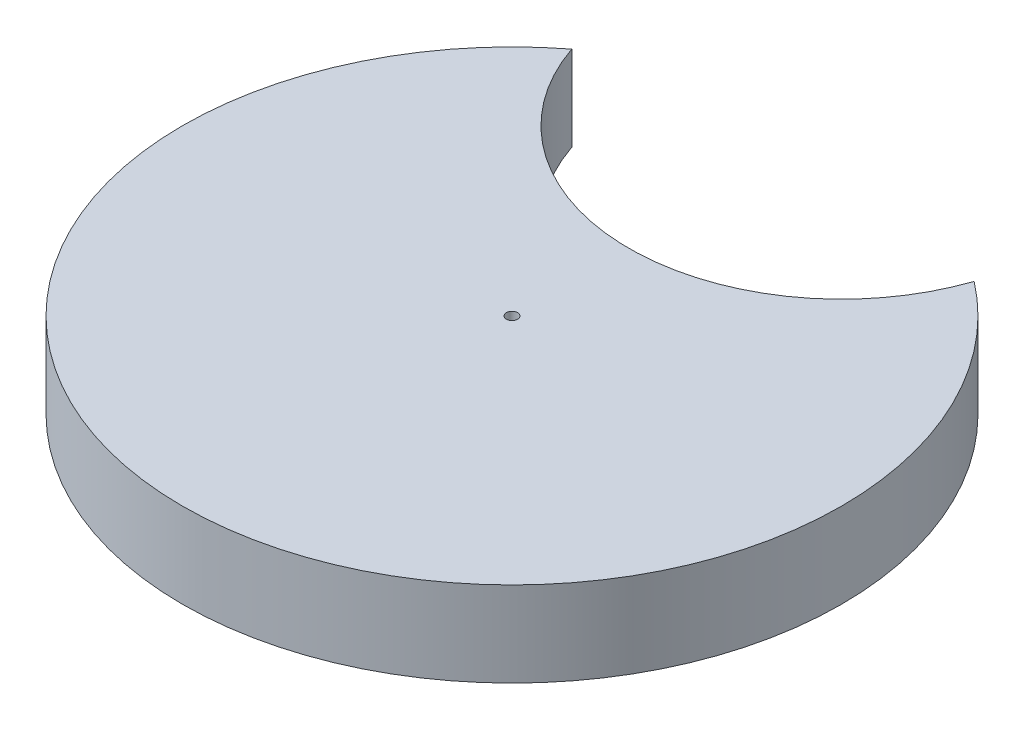
ISO-10303-21;
HEADER;
FILE_DESCRIPTION(('STEP AP214'),'2;1');
FILE_NAME('part.step','',(''),(''),'','','');
FILE_SCHEMA(('AUTOMOTIVE_DESIGN { 1 0 10303 214 1 1 1 1 }'));
ENDSEC;
DATA;
#1=APPLICATION_CONTEXT('core data for automotive mechanical design processes');
#2=APPLICATION_PROTOCOL_DEFINITION('international standard','automotive_design',2000,#1);
#3=PRODUCT_CONTEXT('',#1,'mechanical');
#4=PRODUCT('Part','Part','',(#3));
#5=PRODUCT_RELATED_PRODUCT_CATEGORY('part','',(#4));
#6=PRODUCT_DEFINITION_FORMATION('','',#4);
#7=PRODUCT_DEFINITION_CONTEXT('part definition',#1,'design');
#8=PRODUCT_DEFINITION('design','',#6,#7);
#9=PRODUCT_DEFINITION_SHAPE('','',#8);
#10=(LENGTH_UNIT() NAMED_UNIT(*) SI_UNIT(.MILLI.,.METRE.));
#11=(NAMED_UNIT(*) PLANE_ANGLE_UNIT() SI_UNIT($,.RADIAN.));
#12=(NAMED_UNIT(*) SI_UNIT($,.STERADIAN.) SOLID_ANGLE_UNIT());
#13=UNCERTAINTY_MEASURE_WITH_UNIT(LENGTH_MEASURE(1.E-05),#10,'distance_accuracy_value','');
#14=(GEOMETRIC_REPRESENTATION_CONTEXT(3) GLOBAL_UNCERTAINTY_ASSIGNED_CONTEXT((#13)) GLOBAL_UNIT_ASSIGNED_CONTEXT((#10,
#11,#12)) REPRESENTATION_CONTEXT('',''));
#15=CARTESIAN_POINT('',(0.,0.,0.));
#16=DIRECTION('',(0.,0.,1.));
#17=DIRECTION('',(1.,0.,0.));
#18=AXIS2_PLACEMENT_3D('',#15,#16,#17);
#19=CARTESIAN_POINT('',(0.,0.,0.));
#20=DIRECTION('',(0.,1.,0.));
#21=DIRECTION('',(0.,0.,1.));
#22=AXIS2_PLACEMENT_3D('',#19,#20,#21);
#23=PLANE('',#22);
#24=CARTESIAN_POINT('',(0.,0.,-58.1362137966304));
#25=DIRECTION('',(0.,1.,0.));
#26=DIRECTION('',(0.,0.,1.));
#27=AXIS2_PLACEMENT_3D('',#24,#25,#26);
#28=CIRCLE('',#27,37.5);
#29=CARTESIAN_POINT('',(-35.4961195078054,0.,-46.0417729295377));
#30=VERTEX_POINT('',#29);
#31=CARTESIAN_POINT('',(35.4961195078054,0.,-46.0417729295377));
#32=VERTEX_POINT('',#31);
#33=EDGE_CURVE('E82',#30,#32,#28,.T.);
#34=ORIENTED_EDGE('',*,*,#33,.T.);
#35=CARTESIAN_POINT('',(0.,0.,0.));
#36=DIRECTION('',(0.,1.,0.));
#37=DIRECTION('',(0.,0.,1.));
#38=AXIS2_PLACEMENT_3D('',#35,#36,#37);
#39=CIRCLE('',#38,58.1362137966304);
#40=EDGE_CURVE('E88',#30,#32,#39,.T.);
#41=ORIENTED_EDGE('',*,*,#40,.F.);
#42=EDGE_LOOP('',(#34,#41));
#43=FACE_BOUND('',#42,.T.);
#44=DIRECTION('',(0.,0.,-1.));
#45=VECTOR('',#44,1.);
#46=CARTESIAN_POINT('',(7.44897948556636,0.,0.));
#47=LINE('',#46,#45);
#48=CARTESIAN_POINT('',(7.44897948556636,0.,1.));
#49=VERTEX_POINT('',#48);
#50=CARTESIAN_POINT('',(7.44897948556636,0.,-1.));
#51=VERTEX_POINT('',#50);
#52=EDGE_CURVE('E59',#49,#51,#47,.T.);
#53=ORIENTED_EDGE('',*,*,#52,.T.);
#54=DIRECTION('',(-1.,0.,0.));
#55=VECTOR('',#54,1.);
#56=CARTESIAN_POINT('',(0.,0.,-1.));
#57=LINE('',#56,#55);
#58=CARTESIAN_POINT('',(4.89897948556636,0.,-1.));
#59=VERTEX_POINT('',#58);
#60=EDGE_CURVE('E116',#51,#59,#57,.T.);
#61=ORIENTED_EDGE('',*,*,#60,.T.);
#62=CARTESIAN_POINT('',(0.,0.,0.));
#63=DIRECTION('',(0.,-1.,0.));
#64=DIRECTION('',(0.,0.,-1.));
#65=AXIS2_PLACEMENT_3D('',#62,#63,#64);
#66=CIRCLE('',#65,5.);
#67=CARTESIAN_POINT('',(4.89897948556636,0.,1.));
#68=VERTEX_POINT('',#67);
#69=EDGE_CURVE('E121',#68,#59,#66,.T.);
#70=ORIENTED_EDGE('',*,*,#69,.F.);
#71=DIRECTION('',(1.,0.,0.));
#72=VECTOR('',#71,1.);
#73=CARTESIAN_POINT('',(0.,0.,1.));
#74=LINE('',#73,#72);
#75=EDGE_CURVE('E125',#68,#49,#74,.T.);
#76=ORIENTED_EDGE('',*,*,#75,.T.);
#77=EDGE_LOOP('',(#53,#61,#70,#76));
#78=FACE_BOUND('',#77,.T.);
#79=ADVANCED_FACE('F42',(#43,#78),#23,.F.);
#80=CARTESIAN_POINT('',(0.,15.,-58.1362137966304));
#81=DIRECTION('',(0.,-1.,0.));
#82=DIRECTION('',(0.,0.,-1.));
#83=AXIS2_PLACEMENT_3D('',#80,#81,#82);
#84=CYLINDRICAL_SURFACE('',#83,37.5);
#85=ORIENTED_EDGE('',*,*,#33,.F.);
#86=DIRECTION('',(0.,-1.,0.));
#87=VECTOR('',#86,1.);
#88=CARTESIAN_POINT('',(-35.4961195078054,15.,-46.0417729295377));
#89=LINE('',#88,#87);
#90=CARTESIAN_POINT('',(-35.4961195078054,15.,-46.0417729295377));
#91=VERTEX_POINT('',#90);
#92=EDGE_CURVE('E11',#91,#30,#89,.T.);
#93=ORIENTED_EDGE('',*,*,#92,.F.);
#94=CARTESIAN_POINT('',(0.,15.,-58.1362137966304));
#95=DIRECTION('',(0.,1.,0.));
#96=DIRECTION('',(0.,0.,1.));
#97=AXIS2_PLACEMENT_3D('',#94,#95,#96);
#98=CIRCLE('',#97,37.5);
#99=CARTESIAN_POINT('',(35.4961195078054,15.,-46.0417729295377));
#100=VERTEX_POINT('',#99);
#101=EDGE_CURVE('E83',#91,#100,#98,.T.);
#102=ORIENTED_EDGE('',*,*,#101,.T.);
#103=DIRECTION('',(0.,-1.,0.));
#104=VECTOR('',#103,1.);
#105=CARTESIAN_POINT('',(35.4961195078054,15.,-46.0417729295377));
#106=LINE('',#105,#104);
#107=EDGE_CURVE('E52',#100,#32,#106,.T.);
#108=ORIENTED_EDGE('',*,*,#107,.T.);
#109=EDGE_LOOP('',(#85,#93,#102,#108));
#110=FACE_BOUND('',#109,.T.);
#111=ADVANCED_FACE('F44',(#110),#84,.F.);
#112=CARTESIAN_POINT('',(0.,15.,0.));
#113=DIRECTION('',(0.,-1.,0.));
#114=DIRECTION('',(0.,0.,-1.));
#115=AXIS2_PLACEMENT_3D('',#112,#113,#114);
#116=CYLINDRICAL_SURFACE('',#115,58.1362137966304);
#117=ORIENTED_EDGE('',*,*,#40,.T.);
#118=ORIENTED_EDGE('',*,*,#107,.F.);
#119=CARTESIAN_POINT('',(0.,15.,0.));
#120=DIRECTION('',(0.,1.,0.));
#121=DIRECTION('',(0.,0.,1.));
#122=AXIS2_PLACEMENT_3D('',#119,#120,#121);
#123=CIRCLE('',#122,58.1362137966304);
#124=EDGE_CURVE('E67',#91,#100,#123,.T.);
#125=ORIENTED_EDGE('',*,*,#124,.F.);
#126=ORIENTED_EDGE('',*,*,#92,.T.);
#127=EDGE_LOOP('',(#117,#118,#125,#126));
#128=FACE_BOUND('',#127,.T.);
#129=ADVANCED_FACE('F89',(#128),#116,.T.);
#130=CARTESIAN_POINT('',(0.,15.,0.));
#131=DIRECTION('',(0.,1.,0.));
#132=DIRECTION('',(0.,0.,1.));
#133=AXIS2_PLACEMENT_3D('',#130,#131,#132);
#134=PLANE('',#133);
#135=CARTESIAN_POINT('',(0.,15.,0.));
#136=DIRECTION('',(0.,1.,0.));
#137=DIRECTION('',(0.,0.,1.));
#138=AXIS2_PLACEMENT_3D('',#135,#136,#137);
#139=CIRCLE('',#138,1.);
#140=CARTESIAN_POINT('',(0.,15.,1.));
#141=VERTEX_POINT('',#140);
#142=EDGE_CURVE('E145',#141,#141,#139,.T.);
#143=ORIENTED_EDGE('',*,*,#142,.F.);
#144=EDGE_LOOP('',(#143));
#145=FACE_BOUND('',#144,.T.);
#146=ORIENTED_EDGE('',*,*,#101,.F.);
#147=ORIENTED_EDGE('',*,*,#124,.T.);
#148=EDGE_LOOP('',(#146,#147));
#149=FACE_BOUND('',#148,.T.);
#150=ADVANCED_FACE('F203',(#145,#149),#134,.T.);
#151=CARTESIAN_POINT('',(7.44897948556636,10.,0.));
#152=DIRECTION('',(-1.,0.,0.));
#153=DIRECTION('',(0.,0.,1.));
#154=AXIS2_PLACEMENT_3D('',#151,#152,#153);
#155=PLANE('',#154);
#156=ORIENTED_EDGE('',*,*,#52,.F.);
#157=DIRECTION('',(0.,-1.,0.));
#158=VECTOR('',#157,1.);
#159=CARTESIAN_POINT('',(7.44897948556636,10.,1.));
#160=LINE('',#159,#158);
#161=CARTESIAN_POINT('',(7.44897948556636,10.,1.));
#162=VERTEX_POINT('',#161);
#163=EDGE_CURVE('E105',#162,#49,#160,.T.);
#164=ORIENTED_EDGE('',*,*,#163,.F.);
#165=DIRECTION('',(0.,0.,-1.));
#166=VECTOR('',#165,1.);
#167=CARTESIAN_POINT('',(7.44897948556636,10.,0.));
#168=LINE('',#167,#166);
#169=CARTESIAN_POINT('',(7.44897948556636,10.,-1.));
#170=VERTEX_POINT('',#169);
#171=EDGE_CURVE('E120',#162,#170,#168,.T.);
#172=ORIENTED_EDGE('',*,*,#171,.T.);
#173=DIRECTION('',(0.,-1.,0.));
#174=VECTOR('',#173,1.);
#175=CARTESIAN_POINT('',(7.44897948556636,10.,-1.));
#176=LINE('',#175,#174);
#177=EDGE_CURVE('E95',#170,#51,#176,.T.);
#178=ORIENTED_EDGE('',*,*,#177,.T.);
#179=EDGE_LOOP('',(#156,#164,#172,#178));
#180=FACE_BOUND('',#179,.T.);
#181=ADVANCED_FACE('F170',(#180),#155,.T.);
#182=CARTESIAN_POINT('',(0.,10.,-1.));
#183=DIRECTION('',(0.,0.,1.));
#184=DIRECTION('',(1.,0.,0.));
#185=AXIS2_PLACEMENT_3D('',#182,#183,#184);
#186=PLANE('',#185);
#187=ORIENTED_EDGE('',*,*,#60,.F.);
#188=ORIENTED_EDGE('',*,*,#177,.F.);
#189=DIRECTION('',(-1.,0.,0.));
#190=VECTOR('',#189,1.);
#191=CARTESIAN_POINT('',(0.,10.,-1.));
#192=LINE('',#191,#190);
#193=CARTESIAN_POINT('',(4.89897948556636,10.,-1.));
#194=VERTEX_POINT('',#193);
#195=EDGE_CURVE('E109',#170,#194,#192,.T.);
#196=ORIENTED_EDGE('',*,*,#195,.T.);
#197=DIRECTION('',(0.,-1.,0.));
#198=VECTOR('',#197,1.);
#199=CARTESIAN_POINT('',(4.89897948556636,10.,-1.));
#200=LINE('',#199,#198);
#201=EDGE_CURVE('E98',#194,#59,#200,.T.);
#202=ORIENTED_EDGE('',*,*,#201,.T.);
#203=EDGE_LOOP('',(#187,#188,#196,#202));
#204=FACE_BOUND('',#203,.T.);
#205=ADVANCED_FACE('F175',(#204),#186,.T.);
#206=CARTESIAN_POINT('',(0.,10.,0.));
#207=DIRECTION('',(0.,-1.,0.));
#208=DIRECTION('',(0.,0.,-1.));
#209=AXIS2_PLACEMENT_3D('',#206,#207,#208);
#210=CYLINDRICAL_SURFACE('',#209,5.);
#211=ORIENTED_EDGE('',*,*,#69,.T.);
#212=ORIENTED_EDGE('',*,*,#201,.F.);
#213=CARTESIAN_POINT('',(0.,10.,0.));
#214=DIRECTION('',(0.,-1.,0.));
#215=DIRECTION('',(0.,0.,-1.));
#216=AXIS2_PLACEMENT_3D('',#213,#214,#215);
#217=CIRCLE('',#216,5.);
#218=CARTESIAN_POINT('',(4.89897948556636,10.,1.));
#219=VERTEX_POINT('',#218);
#220=EDGE_CURVE('E134',#219,#194,#217,.T.);
#221=ORIENTED_EDGE('',*,*,#220,.F.);
#222=DIRECTION('',(0.,-1.,0.));
#223=VECTOR('',#222,1.);
#224=CARTESIAN_POINT('',(4.89897948556636,10.,1.));
#225=LINE('',#224,#223);
#226=EDGE_CURVE('E108',#219,#68,#225,.T.);
#227=ORIENTED_EDGE('',*,*,#226,.T.);
#228=EDGE_LOOP('',(#211,#212,#221,#227));
#229=FACE_BOUND('',#228,.T.);
#230=ADVANCED_FACE('F188',(#229),#210,.F.);
#231=CARTESIAN_POINT('',(0.,10.,1.));
#232=DIRECTION('',(0.,0.,-1.));
#233=DIRECTION('',(-1.,0.,0.));
#234=AXIS2_PLACEMENT_3D('',#231,#232,#233);
#235=PLANE('',#234);
#236=ORIENTED_EDGE('',*,*,#75,.F.);
#237=ORIENTED_EDGE('',*,*,#226,.F.);
#238=DIRECTION('',(1.,0.,0.));
#239=VECTOR('',#238,1.);
#240=CARTESIAN_POINT('',(0.,10.,1.));
#241=LINE('',#240,#239);
#242=EDGE_CURVE('E138',#219,#162,#241,.T.);
#243=ORIENTED_EDGE('',*,*,#242,.T.);
#244=ORIENTED_EDGE('',*,*,#163,.T.);
#245=EDGE_LOOP('',(#236,#237,#243,#244));
#246=FACE_BOUND('',#245,.T.);
#247=ADVANCED_FACE('F159',(#246),#235,.T.);
#248=CARTESIAN_POINT('',(0.,10.,0.));
#249=DIRECTION('',(0.,-1.,0.));
#250=DIRECTION('',(0.,0.,-1.));
#251=AXIS2_PLACEMENT_3D('',#248,#249,#250);
#252=PLANE('',#251);
#253=CARTESIAN_POINT('',(0.,10.,0.));
#254=DIRECTION('',(0.,-1.,0.));
#255=DIRECTION('',(0.,0.,-1.));
#256=AXIS2_PLACEMENT_3D('',#253,#254,#255);
#257=CIRCLE('',#256,1.);
#258=CARTESIAN_POINT('',(0.,10.,-1.));
#259=VERTEX_POINT('',#258);
#260=EDGE_CURVE('E46',#259,#259,#257,.T.);
#261=ORIENTED_EDGE('',*,*,#260,.F.);
#262=EDGE_LOOP('',(#261));
#263=FACE_BOUND('',#262,.T.);
#264=ORIENTED_EDGE('',*,*,#171,.F.);
#265=ORIENTED_EDGE('',*,*,#242,.F.);
#266=ORIENTED_EDGE('',*,*,#220,.T.);
#267=ORIENTED_EDGE('',*,*,#195,.F.);
#268=EDGE_LOOP('',(#264,#265,#266,#267));
#269=FACE_BOUND('',#268,.T.);
#270=ADVANCED_FACE('F156',(#263,#269),#252,.T.);
#271=CARTESIAN_POINT('',(0.,5.,0.));
#272=DIRECTION('',(0.,1.,0.));
#273=DIRECTION('',(0.,0.,1.));
#274=AXIS2_PLACEMENT_3D('',#271,#272,#273);
#275=CYLINDRICAL_SURFACE('',#274,1.);
#276=ORIENTED_EDGE('',*,*,#260,.T.);
#277=EDGE_LOOP('',(#276));
#278=FACE_BOUND('',#277,.T.);
#279=ORIENTED_EDGE('',*,*,#142,.T.);
#280=EDGE_LOOP('',(#279));
#281=FACE_BOUND('',#280,.T.);
#282=ADVANCED_FACE('F154',(#278,#281),#275,.F.);
#283=CLOSED_SHELL('',(#79,#111,#129,#150,#181,#205,#230,#247,#270,#282));
#284=MANIFOLD_SOLID_BREP('B2',#283);
#285=ADVANCED_BREP_SHAPE_REPRESENTATION('',(#18,#284),#14);
#286=SHAPE_DEFINITION_REPRESENTATION(#9,#285);
ENDSEC;
END-ISO-10303-21;
